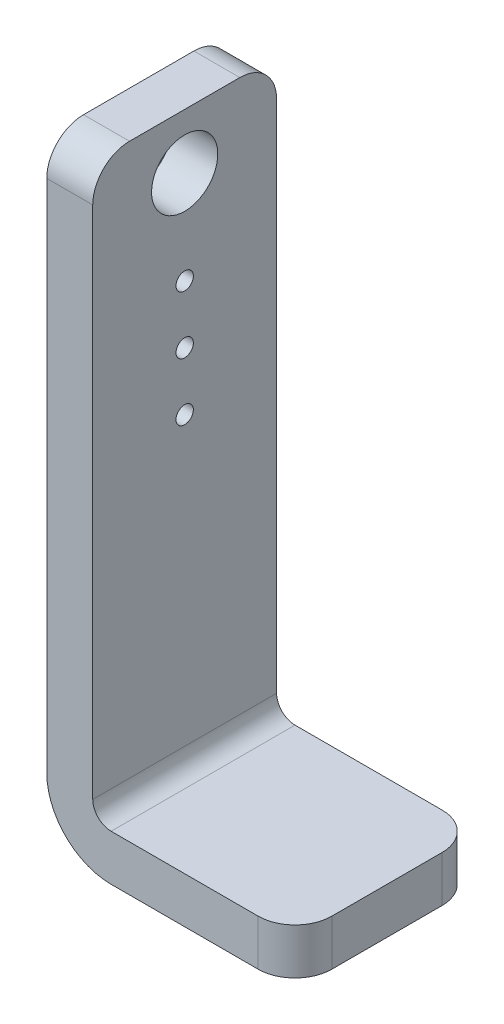
ISO-10303-21;
HEADER;
FILE_DESCRIPTION(('STEP AP214'),'2;1');
FILE_NAME('part.step','',(''),(''),'','','');
FILE_SCHEMA(('AUTOMOTIVE_DESIGN { 1 0 10303 214 1 1 1 1 }'));
ENDSEC;
DATA;
#1=APPLICATION_CONTEXT('core data for automotive mechanical design processes');
#2=APPLICATION_PROTOCOL_DEFINITION('international standard','automotive_design',2000,#1);
#3=PRODUCT_CONTEXT('',#1,'mechanical');
#4=PRODUCT('Part','Part','',(#3));
#5=PRODUCT_RELATED_PRODUCT_CATEGORY('part','',(#4));
#6=PRODUCT_DEFINITION_FORMATION('','',#4);
#7=PRODUCT_DEFINITION_CONTEXT('part definition',#1,'design');
#8=PRODUCT_DEFINITION('design','',#6,#7);
#9=PRODUCT_DEFINITION_SHAPE('','',#8);
#10=(LENGTH_UNIT() NAMED_UNIT(*) SI_UNIT(.MILLI.,.METRE.));
#11=(NAMED_UNIT(*) PLANE_ANGLE_UNIT() SI_UNIT($,.RADIAN.));
#12=(NAMED_UNIT(*) SI_UNIT($,.STERADIAN.) SOLID_ANGLE_UNIT());
#13=UNCERTAINTY_MEASURE_WITH_UNIT(LENGTH_MEASURE(1.E-05),#10,'distance_accuracy_value','');
#14=(GEOMETRIC_REPRESENTATION_CONTEXT(3) GLOBAL_UNCERTAINTY_ASSIGNED_CONTEXT((#13)) GLOBAL_UNIT_ASSIGNED_CONTEXT((#10,
#11,#12)) REPRESENTATION_CONTEXT('',''));
#15=CARTESIAN_POINT('',(0.,0.,0.));
#16=DIRECTION('',(0.,0.,1.));
#17=DIRECTION('',(1.,0.,0.));
#18=AXIS2_PLACEMENT_3D('',#15,#16,#17);
#19=CARTESIAN_POINT('',(0.,26.364540169216,12.7));
#20=DIRECTION('',(0.,-1.,0.));
#21=DIRECTION('',(0.,0.,-1.));
#22=AXIS2_PLACEMENT_3D('',#19,#20,#21);
#23=PLANE('',#22);
#24=DIRECTION('',(0.,0.,-1.));
#25=VECTOR('',#24,1.);
#26=CARTESIAN_POINT('',(0.,26.364540169216,12.7));
#27=LINE('',#26,#25);
#28=CARTESIAN_POINT('',(0.,26.364540169216,10.16));
#29=VERTEX_POINT('',#28);
#30=CARTESIAN_POINT('',(0.,26.364540169216,2.54));
#31=VERTEX_POINT('',#30);
#32=EDGE_CURVE('E160',#29,#31,#27,.T.);
#33=ORIENTED_EDGE('',*,*,#32,.T.);
#34=DIRECTION('',(-1.,0.,0.));
#35=VECTOR('',#34,1.);
#36=CARTESIAN_POINT('',(-3.175,26.364540169216,2.54));
#37=LINE('',#36,#35);
#38=CARTESIAN_POINT('',(-3.175,26.364540169216,2.54));
#39=VERTEX_POINT('',#38);
#40=EDGE_CURVE('E210',#31,#39,#37,.T.);
#41=ORIENTED_EDGE('',*,*,#40,.T.);
#42=DIRECTION('',(0.,0.,-1.));
#43=VECTOR('',#42,1.);
#44=CARTESIAN_POINT('',(-3.175,26.364540169216,12.7));
#45=LINE('',#44,#43);
#46=CARTESIAN_POINT('',(-3.175,26.364540169216,10.16));
#47=VERTEX_POINT('',#46);
#48=EDGE_CURVE('E143',#47,#39,#45,.T.);
#49=ORIENTED_EDGE('',*,*,#48,.F.);
#50=DIRECTION('',(-1.,0.,0.));
#51=VECTOR('',#50,1.);
#52=CARTESIAN_POINT('',(0.,26.364540169216,10.16));
#53=LINE('',#52,#51);
#54=EDGE_CURVE('E53',#47,#29,#53,.F.);
#55=ORIENTED_EDGE('',*,*,#54,.T.);
#56=EDGE_LOOP('',(#33,#41,#49,#55));
#57=FACE_BOUND('',#56,.T.);
#58=ADVANCED_FACE('F33',(#57),#23,.F.);
#59=CARTESIAN_POINT('',(-3.175,26.364540169216,12.7));
#60=DIRECTION('',(1.,0.,0.));
#61=DIRECTION('',(0.,1.,0.));
#62=AXIS2_PLACEMENT_3D('',#59,#60,#61);
#63=PLANE('',#62);
#64=CARTESIAN_POINT('',(-3.175,22.554540169216,6.35));
#65=DIRECTION('',(1.,0.,0.));
#66=DIRECTION('',(0.,1.,0.));
#67=AXIS2_PLACEMENT_3D('',#64,#65,#66);
#68=CIRCLE('',#67,2.286);
#69=CARTESIAN_POINT('',(-3.175,24.840540169216,6.35));
#70=VERTEX_POINT('',#69);
#71=EDGE_CURVE('E163',#70,#70,#68,.T.);
#72=ORIENTED_EDGE('',*,*,#71,.T.);
#73=EDGE_LOOP('',(#72));
#74=FACE_BOUND('',#73,.T.);
#75=CARTESIAN_POINT('',(-3.175,16.104540169216,6.35));
#76=DIRECTION('',(1.,0.,0.));
#77=DIRECTION('',(0.,1.,0.));
#78=AXIS2_PLACEMENT_3D('',#75,#76,#77);
#79=CIRCLE('',#78,0.600000000000018);
#80=CARTESIAN_POINT('',(-3.175,16.704540169216,6.35));
#81=VERTEX_POINT('',#80);
#82=EDGE_CURVE('E422',#81,#81,#79,.T.);
#83=ORIENTED_EDGE('',*,*,#82,.T.);
#84=EDGE_LOOP('',(#83));
#85=FACE_BOUND('',#84,.T.);
#86=CARTESIAN_POINT('',(-3.175,12.104540169216,6.35));
#87=DIRECTION('',(1.,0.,0.));
#88=DIRECTION('',(0.,1.,0.));
#89=AXIS2_PLACEMENT_3D('',#86,#87,#88);
#90=CIRCLE('',#89,0.600000000000017);
#91=CARTESIAN_POINT('',(-3.175,12.704540169216,6.35));
#92=VERTEX_POINT('',#91);
#93=EDGE_CURVE('E414',#92,#92,#90,.T.);
#94=ORIENTED_EDGE('',*,*,#93,.T.);
#95=EDGE_LOOP('',(#94));
#96=FACE_BOUND('',#95,.T.);
#97=CARTESIAN_POINT('',(-3.175,8.10454016921602,6.35));
#98=DIRECTION('',(1.,0.,0.));
#99=DIRECTION('',(0.,1.,0.));
#100=AXIS2_PLACEMENT_3D('',#97,#98,#99);
#101=CIRCLE('',#100,0.600000000000017);
#102=CARTESIAN_POINT('',(-3.175,8.70454016921604,6.35));
#103=VERTEX_POINT('',#102);
#104=EDGE_CURVE('E409',#103,#103,#101,.T.);
#105=ORIENTED_EDGE('',*,*,#104,.T.);
#106=EDGE_LOOP('',(#105));
#107=FACE_BOUND('',#106,.T.);
#108=ORIENTED_EDGE('',*,*,#48,.T.);
#109=CARTESIAN_POINT('',(-3.175,23.824540169216,2.54));
#110=DIRECTION('',(1.,0.,0.));
#111=DIRECTION('',(0.,1.,0.));
#112=AXIS2_PLACEMENT_3D('',#109,#110,#111);
#113=CIRCLE('',#112,2.54);
#114=CARTESIAN_POINT('',(-3.175,23.824540169216,0.));
#115=VERTEX_POINT('',#114);
#116=EDGE_CURVE('E215',#39,#115,#113,.F.);
#117=ORIENTED_EDGE('',*,*,#116,.T.);
#118=DIRECTION('',(0.,-1.,0.));
#119=VECTOR('',#118,1.);
#120=CARTESIAN_POINT('',(-3.175,26.364540169216,0.));
#121=LINE('',#120,#119);
#122=CARTESIAN_POINT('',(-3.175,-11.735459830784,0.));
#123=VERTEX_POINT('',#122);
#124=EDGE_CURVE('E140',#115,#123,#121,.T.);
#125=ORIENTED_EDGE('',*,*,#124,.T.);
#126=DIRECTION('',(0.,0.,-1.));
#127=VECTOR('',#126,1.);
#128=CARTESIAN_POINT('',(-3.175,-11.735459830784,12.7));
#129=LINE('',#128,#127);
#130=CARTESIAN_POINT('',(-3.175,-11.735459830784,12.7));
#131=VERTEX_POINT('',#130);
#132=EDGE_CURVE('E136',#131,#123,#129,.T.);
#133=ORIENTED_EDGE('',*,*,#132,.F.);
#134=DIRECTION('',(0.,-1.,0.));
#135=VECTOR('',#134,1.);
#136=CARTESIAN_POINT('',(-3.175,26.364540169216,12.7));
#137=LINE('',#136,#135);
#138=CARTESIAN_POINT('',(-3.175,23.824540169216,12.7));
#139=VERTEX_POINT('',#138);
#140=EDGE_CURVE('E122',#139,#131,#137,.T.);
#141=ORIENTED_EDGE('',*,*,#140,.F.);
#142=CARTESIAN_POINT('',(-3.175,23.824540169216,10.16));
#143=DIRECTION('',(1.,0.,0.));
#144=DIRECTION('',(0.,1.,0.));
#145=AXIS2_PLACEMENT_3D('',#142,#143,#144);
#146=CIRCLE('',#145,2.54);
#147=EDGE_CURVE('E213',#139,#47,#146,.F.);
#148=ORIENTED_EDGE('',*,*,#147,.T.);
#149=EDGE_LOOP('',(#108,#117,#125,#133,#141,#148));
#150=FACE_BOUND('',#149,.T.);
#151=ADVANCED_FACE('F138',(#74,#85,#96,#107,#150),#63,.F.);
#152=CARTESIAN_POINT('',(1.27,-11.735459830784,12.7));
#153=DIRECTION('',(0.,0.,-1.));
#154=DIRECTION('',(-1.,0.,0.));
#155=AXIS2_PLACEMENT_3D('',#152,#153,#154);
#156=CYLINDRICAL_SURFACE('',#155,4.445);
#157=CARTESIAN_POINT('',(1.27,-11.735459830784,0.));
#158=DIRECTION('',(0.,0.,1.));
#159=DIRECTION('',(-1.,0.,0.));
#160=AXIS2_PLACEMENT_3D('',#157,#158,#159);
#161=CIRCLE('',#160,4.445);
#162=CARTESIAN_POINT('',(1.27,-16.180459830784,0.));
#163=VERTEX_POINT('',#162);
#164=EDGE_CURVE('E162',#123,#163,#161,.T.);
#165=ORIENTED_EDGE('',*,*,#164,.T.);
#166=DIRECTION('',(0.,0.,-1.));
#167=VECTOR('',#166,1.);
#168=CARTESIAN_POINT('',(1.27,-16.180459830784,12.7));
#169=LINE('',#168,#167);
#170=CARTESIAN_POINT('',(1.27,-16.180459830784,12.7));
#171=VERTEX_POINT('',#170);
#172=EDGE_CURVE('E144',#171,#163,#169,.T.);
#173=ORIENTED_EDGE('',*,*,#172,.F.);
#174=CARTESIAN_POINT('',(1.27,-11.735459830784,12.7));
#175=DIRECTION('',(0.,0.,1.));
#176=DIRECTION('',(-1.,0.,0.));
#177=AXIS2_PLACEMENT_3D('',#174,#175,#176);
#178=CIRCLE('',#177,4.445);
#179=EDGE_CURVE('E127',#131,#171,#178,.T.);
#180=ORIENTED_EDGE('',*,*,#179,.F.);
#181=ORIENTED_EDGE('',*,*,#132,.T.);
#182=EDGE_LOOP('',(#165,#173,#180,#181));
#183=FACE_BOUND('',#182,.T.);
#184=ADVANCED_FACE('F146',(#183),#156,.T.);
#185=CARTESIAN_POINT('',(1.27,-16.180459830784,12.7));
#186=DIRECTION('',(0.,1.,0.));
#187=DIRECTION('',(-1.,0.,0.));
#188=AXIS2_PLACEMENT_3D('',#185,#186,#187);
#189=PLANE('',#188);
#190=DIRECTION('',(1.,0.,0.));
#191=VECTOR('',#190,1.);
#192=CARTESIAN_POINT('',(1.27,-16.180459830784,0.));
#193=LINE('',#192,#191);
#194=CARTESIAN_POINT('',(11.43,-16.180459830784,0.));
#195=VERTEX_POINT('',#194);
#196=EDGE_CURVE('E165',#163,#195,#193,.T.);
#197=ORIENTED_EDGE('',*,*,#196,.T.);
#198=CARTESIAN_POINT('',(11.43,-16.180459830784,2.54));
#199=DIRECTION('',(0.,1.,0.));
#200=DIRECTION('',(-1.,0.,0.));
#201=AXIS2_PLACEMENT_3D('',#198,#199,#200);
#202=CIRCLE('',#201,2.54);
#203=CARTESIAN_POINT('',(13.97,-16.180459830784,2.54));
#204=VERTEX_POINT('',#203);
#205=EDGE_CURVE('E203',#195,#204,#202,.F.);
#206=ORIENTED_EDGE('',*,*,#205,.T.);
#207=DIRECTION('',(0.,0.,-1.));
#208=VECTOR('',#207,1.);
#209=CARTESIAN_POINT('',(13.97,-16.180459830784,12.7));
#210=LINE('',#209,#208);
#211=CARTESIAN_POINT('',(13.97,-16.180459830784,10.16));
#212=VERTEX_POINT('',#211);
#213=EDGE_CURVE('E183',#212,#204,#210,.T.);
#214=ORIENTED_EDGE('',*,*,#213,.F.);
#215=CARTESIAN_POINT('',(11.43,-16.180459830784,10.16));
#216=DIRECTION('',(0.,1.,0.));
#217=DIRECTION('',(-1.,0.,0.));
#218=AXIS2_PLACEMENT_3D('',#215,#216,#217);
#219=CIRCLE('',#218,2.54);
#220=CARTESIAN_POINT('',(11.43,-16.180459830784,12.7));
#221=VERTEX_POINT('',#220);
#222=EDGE_CURVE('E201',#212,#221,#219,.F.);
#223=ORIENTED_EDGE('',*,*,#222,.T.);
#224=DIRECTION('',(1.,0.,0.));
#225=VECTOR('',#224,1.);
#226=CARTESIAN_POINT('',(1.27,-16.180459830784,12.7));
#227=LINE('',#226,#225);
#228=EDGE_CURVE('E149',#171,#221,#227,.T.);
#229=ORIENTED_EDGE('',*,*,#228,.F.);
#230=ORIENTED_EDGE('',*,*,#172,.T.);
#231=EDGE_LOOP('',(#197,#206,#214,#223,#229,#230));
#232=FACE_BOUND('',#231,.T.);
#233=ADVANCED_FACE('F232',(#232),#189,.F.);
#234=CARTESIAN_POINT('',(13.97,-13.005459830784,12.7));
#235=DIRECTION('',(-1.,0.,0.));
#236=DIRECTION('',(0.,0.,1.));
#237=AXIS2_PLACEMENT_3D('',#234,#235,#236);
#238=PLANE('',#237);
#239=ORIENTED_EDGE('',*,*,#213,.T.);
#240=DIRECTION('',(0.,1.,0.));
#241=VECTOR('',#240,1.);
#242=CARTESIAN_POINT('',(13.97,-13.005459830784,2.54));
#243=LINE('',#242,#241);
#244=CARTESIAN_POINT('',(13.97,-13.005459830784,2.54));
#245=VERTEX_POINT('',#244);
#246=EDGE_CURVE('E190',#204,#245,#243,.T.);
#247=ORIENTED_EDGE('',*,*,#246,.T.);
#248=DIRECTION('',(0.,0.,-1.));
#249=VECTOR('',#248,1.);
#250=CARTESIAN_POINT('',(13.97,-13.005459830784,12.7));
#251=LINE('',#250,#249);
#252=CARTESIAN_POINT('',(13.97,-13.005459830784,10.16));
#253=VERTEX_POINT('',#252);
#254=EDGE_CURVE('E180',#253,#245,#251,.T.);
#255=ORIENTED_EDGE('',*,*,#254,.F.);
#256=DIRECTION('',(0.,1.,0.));
#257=VECTOR('',#256,1.);
#258=CARTESIAN_POINT('',(13.97,-13.005459830784,10.16));
#259=LINE('',#258,#257);
#260=EDGE_CURVE('E188',#253,#212,#259,.F.);
#261=ORIENTED_EDGE('',*,*,#260,.T.);
#262=EDGE_LOOP('',(#239,#247,#255,#261));
#263=FACE_BOUND('',#262,.T.);
#264=ADVANCED_FACE('F246',(#263),#238,.F.);
#265=CARTESIAN_POINT('',(1.27,-13.005459830784,12.7));
#266=DIRECTION('',(0.,-1.,0.));
#267=DIRECTION('',(1.,0.,0.));
#268=AXIS2_PLACEMENT_3D('',#265,#266,#267);
#269=PLANE('',#268);
#270=ORIENTED_EDGE('',*,*,#254,.T.);
#271=CARTESIAN_POINT('',(11.43,-13.005459830784,2.54));
#272=DIRECTION('',(0.,-1.,0.));
#273=DIRECTION('',(1.,0.,0.));
#274=AXIS2_PLACEMENT_3D('',#271,#272,#273);
#275=CIRCLE('',#274,2.54);
#276=CARTESIAN_POINT('',(11.43,-13.005459830784,0.));
#277=VERTEX_POINT('',#276);
#278=EDGE_CURVE('E195',#245,#277,#275,.F.);
#279=ORIENTED_EDGE('',*,*,#278,.T.);
#280=DIRECTION('',(-1.,0.,0.));
#281=VECTOR('',#280,1.);
#282=CARTESIAN_POINT('',(1.27,-13.005459830784,0.));
#283=LINE('',#282,#281);
#284=CARTESIAN_POINT('',(1.27,-13.005459830784,0.));
#285=VERTEX_POINT('',#284);
#286=EDGE_CURVE('E168',#277,#285,#283,.T.);
#287=ORIENTED_EDGE('',*,*,#286,.T.);
#288=DIRECTION('',(0.,0.,-1.));
#289=VECTOR('',#288,1.);
#290=CARTESIAN_POINT('',(1.27,-13.005459830784,12.7));
#291=LINE('',#290,#289);
#292=CARTESIAN_POINT('',(1.27,-13.005459830784,12.7));
#293=VERTEX_POINT('',#292);
#294=EDGE_CURVE('E177',#293,#285,#291,.T.);
#295=ORIENTED_EDGE('',*,*,#294,.F.);
#296=DIRECTION('',(-1.,0.,0.));
#297=VECTOR('',#296,1.);
#298=CARTESIAN_POINT('',(1.27,-13.005459830784,12.7));
#299=LINE('',#298,#297);
#300=CARTESIAN_POINT('',(11.43,-13.005459830784,12.7));
#301=VERTEX_POINT('',#300);
#302=EDGE_CURVE('E151',#301,#293,#299,.T.);
#303=ORIENTED_EDGE('',*,*,#302,.F.);
#304=CARTESIAN_POINT('',(11.43,-13.005459830784,10.16));
#305=DIRECTION('',(0.,-1.,0.));
#306=DIRECTION('',(1.,0.,0.));
#307=AXIS2_PLACEMENT_3D('',#304,#305,#306);
#308=CIRCLE('',#307,2.54);
#309=EDGE_CURVE('E193',#301,#253,#308,.F.);
#310=ORIENTED_EDGE('',*,*,#309,.T.);
#311=EDGE_LOOP('',(#270,#279,#287,#295,#303,#310));
#312=FACE_BOUND('',#311,.T.);
#313=ADVANCED_FACE('F243',(#312),#269,.F.);
#314=CARTESIAN_POINT('',(1.27,-11.735459830784,12.7));
#315=DIRECTION('',(0.,0.,-1.));
#316=DIRECTION('',(-1.,0.,0.));
#317=AXIS2_PLACEMENT_3D('',#314,#315,#316);
#318=CYLINDRICAL_SURFACE('',#317,1.27);
#319=CARTESIAN_POINT('',(1.27,-11.735459830784,0.));
#320=DIRECTION('',(0.,0.,-1.));
#321=DIRECTION('',(-1.,0.,0.));
#322=AXIS2_PLACEMENT_3D('',#319,#320,#321);
#323=CIRCLE('',#322,1.27);
#324=CARTESIAN_POINT('',(0.,-11.735459830784,0.));
#325=VERTEX_POINT('',#324);
#326=EDGE_CURVE('E170',#285,#325,#323,.T.);
#327=ORIENTED_EDGE('',*,*,#326,.T.);
#328=DIRECTION('',(0.,0.,-1.));
#329=VECTOR('',#328,1.);
#330=CARTESIAN_POINT('',(0.,-11.735459830784,12.7));
#331=LINE('',#330,#329);
#332=CARTESIAN_POINT('',(0.,-11.735459830784,12.7));
#333=VERTEX_POINT('',#332);
#334=EDGE_CURVE('E174',#333,#325,#331,.T.);
#335=ORIENTED_EDGE('',*,*,#334,.F.);
#336=CARTESIAN_POINT('',(1.27,-11.735459830784,12.7));
#337=DIRECTION('',(0.,0.,-1.));
#338=DIRECTION('',(-1.,0.,0.));
#339=AXIS2_PLACEMENT_3D('',#336,#337,#338);
#340=CIRCLE('',#339,1.27);
#341=EDGE_CURVE('E156',#293,#333,#340,.T.);
#342=ORIENTED_EDGE('',*,*,#341,.F.);
#343=ORIENTED_EDGE('',*,*,#294,.T.);
#344=EDGE_LOOP('',(#327,#335,#342,#343));
#345=FACE_BOUND('',#344,.T.);
#346=ADVANCED_FACE('F253',(#345),#318,.F.);
#347=CARTESIAN_POINT('',(0.,26.364540169216,12.7));
#348=DIRECTION('',(-1.,0.,0.));
#349=DIRECTION('',(0.,-1.,0.));
#350=AXIS2_PLACEMENT_3D('',#347,#348,#349);
#351=PLANE('',#350);
#352=CARTESIAN_POINT('',(0.,22.554540169216,6.35));
#353=DIRECTION('',(-1.,0.,0.));
#354=DIRECTION('',(0.,-1.,0.));
#355=AXIS2_PLACEMENT_3D('',#352,#353,#354);
#356=CIRCLE('',#355,2.286);
#357=CARTESIAN_POINT('',(0.,20.268540169216,6.35));
#358=VERTEX_POINT('',#357);
#359=EDGE_CURVE('E428',#358,#358,#356,.T.);
#360=ORIENTED_EDGE('',*,*,#359,.T.);
#361=EDGE_LOOP('',(#360));
#362=FACE_BOUND('',#361,.T.);
#363=CARTESIAN_POINT('',(0.,16.104540169216,6.35));
#364=DIRECTION('',(-1.,0.,0.));
#365=DIRECTION('',(0.,-1.,0.));
#366=AXIS2_PLACEMENT_3D('',#363,#364,#365);
#367=CIRCLE('',#366,0.600000000000018);
#368=CARTESIAN_POINT('',(0.,15.504540169216,6.35));
#369=VERTEX_POINT('',#368);
#370=EDGE_CURVE('E425',#369,#369,#367,.T.);
#371=ORIENTED_EDGE('',*,*,#370,.T.);
#372=EDGE_LOOP('',(#371));
#373=FACE_BOUND('',#372,.T.);
#374=CARTESIAN_POINT('',(0.,12.104540169216,6.35));
#375=DIRECTION('',(-1.,0.,0.));
#376=DIRECTION('',(0.,-1.,0.));
#377=AXIS2_PLACEMENT_3D('',#374,#375,#376);
#378=CIRCLE('',#377,0.600000000000017);
#379=CARTESIAN_POINT('',(0.,11.504540169216,6.35));
#380=VERTEX_POINT('',#379);
#381=EDGE_CURVE('E417',#380,#380,#378,.T.);
#382=ORIENTED_EDGE('',*,*,#381,.T.);
#383=EDGE_LOOP('',(#382));
#384=FACE_BOUND('',#383,.T.);
#385=CARTESIAN_POINT('',(0.,8.10454016921602,6.35));
#386=DIRECTION('',(-1.,0.,0.));
#387=DIRECTION('',(0.,-1.,0.));
#388=AXIS2_PLACEMENT_3D('',#385,#386,#387);
#389=CIRCLE('',#388,0.600000000000017);
#390=CARTESIAN_POINT('',(0.,7.50454016921601,6.35));
#391=VERTEX_POINT('',#390);
#392=EDGE_CURVE('E412',#391,#391,#389,.T.);
#393=ORIENTED_EDGE('',*,*,#392,.T.);
#394=EDGE_LOOP('',(#393));
#395=FACE_BOUND('',#394,.T.);
#396=DIRECTION('',(0.,1.,0.));
#397=VECTOR('',#396,1.);
#398=CARTESIAN_POINT('',(0.,26.364540169216,0.));
#399=LINE('',#398,#397);
#400=CARTESIAN_POINT('',(0.,23.824540169216,0.));
#401=VERTEX_POINT('',#400);
#402=EDGE_CURVE('E133',#325,#401,#399,.T.);
#403=ORIENTED_EDGE('',*,*,#402,.T.);
#404=CARTESIAN_POINT('',(0.,23.824540169216,2.54));
#405=DIRECTION('',(-1.,0.,0.));
#406=DIRECTION('',(0.,-1.,0.));
#407=AXIS2_PLACEMENT_3D('',#404,#405,#406);
#408=CIRCLE('',#407,2.54);
#409=EDGE_CURVE('E11',#401,#31,#408,.F.);
#410=ORIENTED_EDGE('',*,*,#409,.T.);
#411=ORIENTED_EDGE('',*,*,#32,.F.);
#412=CARTESIAN_POINT('',(0.,23.824540169216,10.16));
#413=DIRECTION('',(-1.,0.,0.));
#414=DIRECTION('',(0.,-1.,0.));
#415=AXIS2_PLACEMENT_3D('',#412,#413,#414);
#416=CIRCLE('',#415,2.54);
#417=CARTESIAN_POINT('',(0.,23.824540169216,12.7));
#418=VERTEX_POINT('',#417);
#419=EDGE_CURVE('E41',#29,#418,#416,.F.);
#420=ORIENTED_EDGE('',*,*,#419,.T.);
#421=DIRECTION('',(0.,1.,0.));
#422=VECTOR('',#421,1.);
#423=CARTESIAN_POINT('',(0.,26.364540169216,12.7));
#424=LINE('',#423,#422);
#425=EDGE_CURVE('E158',#333,#418,#424,.T.);
#426=ORIENTED_EDGE('',*,*,#425,.F.);
#427=ORIENTED_EDGE('',*,*,#334,.T.);
#428=EDGE_LOOP('',(#403,#410,#411,#420,#426,#427));
#429=FACE_BOUND('',#428,.T.);
#430=ADVANCED_FACE('F218',(#362,#373,#384,#395,#429),#351,.F.);
#431=CARTESIAN_POINT('',(1.27,-11.735459830784,12.7));
#432=DIRECTION('',(0.,0.,-1.));
#433=DIRECTION('',(-1.,0.,0.));
#434=AXIS2_PLACEMENT_3D('',#431,#432,#433);
#435=PLANE('',#434);
#436=ORIENTED_EDGE('',*,*,#228,.T.);
#437=DIRECTION('',(0.,1.,0.));
#438=VECTOR('',#437,1.);
#439=CARTESIAN_POINT('',(11.43,-11.735459830784,12.7));
#440=LINE('',#439,#438);
#441=EDGE_CURVE('E206',#221,#301,#440,.T.);
#442=ORIENTED_EDGE('',*,*,#441,.T.);
#443=ORIENTED_EDGE('',*,*,#302,.T.);
#444=ORIENTED_EDGE('',*,*,#341,.T.);
#445=ORIENTED_EDGE('',*,*,#425,.T.);
#446=DIRECTION('',(-1.,0.,0.));
#447=VECTOR('',#446,1.);
#448=CARTESIAN_POINT('',(1.27,23.824540169216,12.7));
#449=LINE('',#448,#447);
#450=EDGE_CURVE('E131',#418,#139,#449,.T.);
#451=ORIENTED_EDGE('',*,*,#450,.T.);
#452=ORIENTED_EDGE('',*,*,#140,.T.);
#453=ORIENTED_EDGE('',*,*,#179,.T.);
#454=EDGE_LOOP('',(#436,#442,#443,#444,#445,#451,#452,#453));
#455=FACE_BOUND('',#454,.T.);
#456=ADVANCED_FACE('F125',(#455),#435,.F.);
#457=CARTESIAN_POINT('',(1.27,-11.735459830784,0.));
#458=DIRECTION('',(0.,0.,-1.));
#459=DIRECTION('',(-1.,0.,0.));
#460=AXIS2_PLACEMENT_3D('',#457,#458,#459);
#461=PLANE('',#460);
#462=ORIENTED_EDGE('',*,*,#286,.F.);
#463=DIRECTION('',(0.,1.,0.));
#464=VECTOR('',#463,1.);
#465=CARTESIAN_POINT('',(11.43,-16.180459830784,0.));
#466=LINE('',#465,#464);
#467=EDGE_CURVE('E199',#277,#195,#466,.F.);
#468=ORIENTED_EDGE('',*,*,#467,.T.);
#469=ORIENTED_EDGE('',*,*,#196,.F.);
#470=ORIENTED_EDGE('',*,*,#164,.F.);
#471=ORIENTED_EDGE('',*,*,#124,.F.);
#472=DIRECTION('',(-1.,0.,0.));
#473=VECTOR('',#472,1.);
#474=CARTESIAN_POINT('',(0.,23.824540169216,0.));
#475=LINE('',#474,#473);
#476=EDGE_CURVE('E197',#115,#401,#475,.F.);
#477=ORIENTED_EDGE('',*,*,#476,.T.);
#478=ORIENTED_EDGE('',*,*,#402,.F.);
#479=ORIENTED_EDGE('',*,*,#326,.F.);
#480=EDGE_LOOP('',(#462,#468,#469,#470,#471,#477,#478,#479));
#481=FACE_BOUND('',#480,.T.);
#482=ADVANCED_FACE('F228',(#481),#461,.T.);
#483=CARTESIAN_POINT('',(13.971,8.10454016921602,6.35));
#484=DIRECTION('',(-1.,0.,0.));
#485=DIRECTION('',(0.,-1.,0.));
#486=AXIS2_PLACEMENT_3D('',#483,#484,#485);
#487=CYLINDRICAL_SURFACE('',#486,0.600000000000017);
#488=ORIENTED_EDGE('',*,*,#104,.F.);
#489=EDGE_LOOP('',(#488));
#490=FACE_BOUND('',#489,.T.);
#491=ORIENTED_EDGE('',*,*,#392,.F.);
#492=EDGE_LOOP('',(#491));
#493=FACE_BOUND('',#492,.T.);
#494=ADVANCED_FACE('F309',(#490,#493),#487,.F.);
#495=CARTESIAN_POINT('',(13.971,12.104540169216,6.35));
#496=DIRECTION('',(-1.,0.,0.));
#497=DIRECTION('',(0.,-1.,0.));
#498=AXIS2_PLACEMENT_3D('',#495,#496,#497);
#499=CYLINDRICAL_SURFACE('',#498,0.600000000000017);
#500=ORIENTED_EDGE('',*,*,#93,.F.);
#501=EDGE_LOOP('',(#500));
#502=FACE_BOUND('',#501,.T.);
#503=ORIENTED_EDGE('',*,*,#381,.F.);
#504=EDGE_LOOP('',(#503));
#505=FACE_BOUND('',#504,.T.);
#506=ADVANCED_FACE('F377',(#502,#505),#499,.F.);
#507=CARTESIAN_POINT('',(13.971,16.104540169216,6.35));
#508=DIRECTION('',(-1.,0.,0.));
#509=DIRECTION('',(0.,-1.,0.));
#510=AXIS2_PLACEMENT_3D('',#507,#508,#509);
#511=CYLINDRICAL_SURFACE('',#510,0.600000000000018);
#512=ORIENTED_EDGE('',*,*,#82,.F.);
#513=EDGE_LOOP('',(#512));
#514=FACE_BOUND('',#513,.T.);
#515=ORIENTED_EDGE('',*,*,#370,.F.);
#516=EDGE_LOOP('',(#515));
#517=FACE_BOUND('',#516,.T.);
#518=ADVANCED_FACE('F367',(#514,#517),#511,.F.);
#519=CARTESIAN_POINT('',(13.971,22.554540169216,6.35));
#520=DIRECTION('',(-1.,0.,0.));
#521=DIRECTION('',(0.,-1.,0.));
#522=AXIS2_PLACEMENT_3D('',#519,#520,#521);
#523=CYLINDRICAL_SURFACE('',#522,2.286);
#524=ORIENTED_EDGE('',*,*,#71,.F.);
#525=EDGE_LOOP('',(#524));
#526=FACE_BOUND('',#525,.T.);
#527=ORIENTED_EDGE('',*,*,#359,.F.);
#528=EDGE_LOOP('',(#527));
#529=FACE_BOUND('',#528,.T.);
#530=ADVANCED_FACE('F274',(#526,#529),#523,.F.);
#531=CARTESIAN_POINT('',(11.43,-13.005459830784,2.54));
#532=DIRECTION('',(0.,-1.,0.));
#533=DIRECTION('',(0.,0.,-1.));
#534=AXIS2_PLACEMENT_3D('',#531,#532,#533);
#535=CYLINDRICAL_SURFACE('',#534,2.54);
#536=ORIENTED_EDGE('',*,*,#205,.F.);
#537=ORIENTED_EDGE('',*,*,#467,.F.);
#538=ORIENTED_EDGE('',*,*,#278,.F.);
#539=ORIENTED_EDGE('',*,*,#246,.F.);
#540=EDGE_LOOP('',(#536,#537,#538,#539));
#541=FACE_BOUND('',#540,.T.);
#542=ADVANCED_FACE('F249',(#541),#535,.T.);
#543=CARTESIAN_POINT('',(11.43,-11.735459830784,10.16));
#544=DIRECTION('',(0.,1.,0.));
#545=DIRECTION('',(0.,0.,1.));
#546=AXIS2_PLACEMENT_3D('',#543,#544,#545);
#547=CYLINDRICAL_SURFACE('',#546,2.54);
#548=ORIENTED_EDGE('',*,*,#222,.F.);
#549=ORIENTED_EDGE('',*,*,#260,.F.);
#550=ORIENTED_EDGE('',*,*,#309,.F.);
#551=ORIENTED_EDGE('',*,*,#441,.F.);
#552=EDGE_LOOP('',(#548,#549,#550,#551));
#553=FACE_BOUND('',#552,.T.);
#554=ADVANCED_FACE('F239',(#553),#547,.T.);
#555=CARTESIAN_POINT('',(0.,23.824540169216,2.54));
#556=DIRECTION('',(1.,0.,0.));
#557=DIRECTION('',(0.,0.,-1.));
#558=AXIS2_PLACEMENT_3D('',#555,#556,#557);
#559=CYLINDRICAL_SURFACE('',#558,2.54);
#560=ORIENTED_EDGE('',*,*,#409,.F.);
#561=ORIENTED_EDGE('',*,*,#476,.F.);
#562=ORIENTED_EDGE('',*,*,#116,.F.);
#563=ORIENTED_EDGE('',*,*,#40,.F.);
#564=EDGE_LOOP('',(#560,#561,#562,#563));
#565=FACE_BOUND('',#564,.T.);
#566=ADVANCED_FACE('F224',(#565),#559,.T.);
#567=CARTESIAN_POINT('',(1.27,23.824540169216,10.16));
#568=DIRECTION('',(-1.,0.,0.));
#569=DIRECTION('',(0.,0.,1.));
#570=AXIS2_PLACEMENT_3D('',#567,#568,#569);
#571=CYLINDRICAL_SURFACE('',#570,2.54);
#572=ORIENTED_EDGE('',*,*,#419,.F.);
#573=ORIENTED_EDGE('',*,*,#54,.F.);
#574=ORIENTED_EDGE('',*,*,#147,.F.);
#575=ORIENTED_EDGE('',*,*,#450,.F.);
#576=EDGE_LOOP('',(#572,#573,#574,#575));
#577=FACE_BOUND('',#576,.T.);
#578=ADVANCED_FACE('F35',(#577),#571,.T.);
#579=CLOSED_SHELL('',(#58,#151,#184,#233,#264,#313,#346,#430,#456,#482,#494,#506,#518,#530,#542,
#554,#566,#578));
#580=MANIFOLD_SOLID_BREP('B2',#579);
#581=ADVANCED_BREP_SHAPE_REPRESENTATION('',(#18,#580),#14);
#582=SHAPE_DEFINITION_REPRESENTATION(#9,#581);
ENDSEC;
END-ISO-10303-21;
